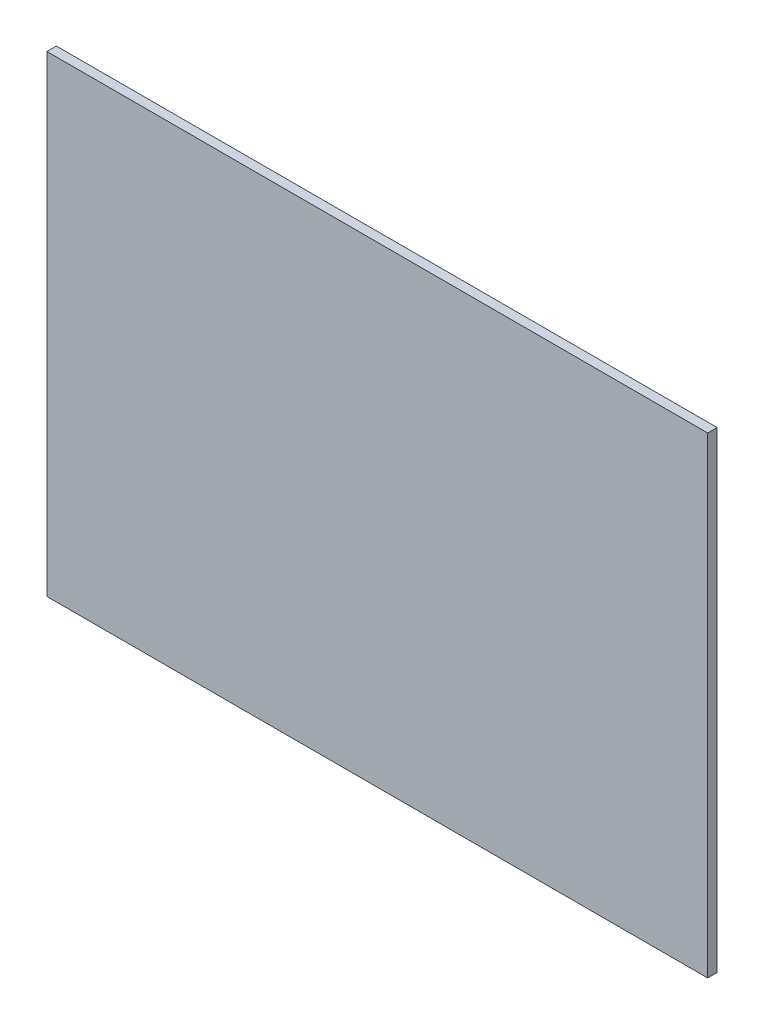
ISO-10303-21;
HEADER;
FILE_DESCRIPTION(('STEP AP214'),'2;1');
FILE_NAME('part.step','',(''),(''),'','','');
FILE_SCHEMA(('AUTOMOTIVE_DESIGN { 1 0 10303 214 1 1 1 1 }'));
ENDSEC;
DATA;
#1=APPLICATION_CONTEXT('core data for automotive mechanical design processes');
#2=APPLICATION_PROTOCOL_DEFINITION('international standard','automotive_design',2000,#1);
#3=PRODUCT_CONTEXT('',#1,'mechanical');
#4=PRODUCT('Part','Part','',(#3));
#5=PRODUCT_RELATED_PRODUCT_CATEGORY('part','',(#4));
#6=PRODUCT_DEFINITION_FORMATION('','',#4);
#7=PRODUCT_DEFINITION_CONTEXT('part definition',#1,'design');
#8=PRODUCT_DEFINITION('design','',#6,#7);
#9=PRODUCT_DEFINITION_SHAPE('','',#8);
#10=(LENGTH_UNIT() NAMED_UNIT(*) SI_UNIT(.MILLI.,.METRE.));
#11=(NAMED_UNIT(*) PLANE_ANGLE_UNIT() SI_UNIT($,.RADIAN.));
#12=(NAMED_UNIT(*) SI_UNIT($,.STERADIAN.) SOLID_ANGLE_UNIT());
#13=UNCERTAINTY_MEASURE_WITH_UNIT(LENGTH_MEASURE(1.E-05),#10,'distance_accuracy_value','');
#14=(GEOMETRIC_REPRESENTATION_CONTEXT(3) GLOBAL_UNCERTAINTY_ASSIGNED_CONTEXT((#13)) GLOBAL_UNIT_ASSIGNED_CONTEXT((#10,
#11,#12)) REPRESENTATION_CONTEXT('',''));
#15=CARTESIAN_POINT('',(0.,0.,0.));
#16=DIRECTION('',(0.,0.,1.));
#17=DIRECTION('',(1.,0.,0.));
#18=AXIS2_PLACEMENT_3D('',#15,#16,#17);
#19=CARTESIAN_POINT('',(0.,0.,10.));
#20=DIRECTION('',(-1.,0.,0.));
#21=DIRECTION('',(0.,-1.,0.));
#22=AXIS2_PLACEMENT_3D('',#19,#20,#21);
#23=PLANE('',#22);
#24=DIRECTION('',(0.,1.,0.));
#25=VECTOR('',#24,1.);
#26=CARTESIAN_POINT('',(0.,0.,0.));
#27=LINE('',#26,#25);
#28=CARTESIAN_POINT('',(0.,0.,0.));
#29=VERTEX_POINT('',#28);
#30=CARTESIAN_POINT('',(0.,500.,0.));
#31=VERTEX_POINT('',#30);
#32=EDGE_CURVE('E96',#29,#31,#27,.T.);
#33=ORIENTED_EDGE('',*,*,#32,.T.);
#34=DIRECTION('',(0.,0.,-1.));
#35=VECTOR('',#34,1.);
#36=CARTESIAN_POINT('',(0.,500.,10.));
#37=LINE('',#36,#35);
#38=CARTESIAN_POINT('',(0.,500.,10.));
#39=VERTEX_POINT('',#38);
#40=EDGE_CURVE('E11',#39,#31,#37,.T.);
#41=ORIENTED_EDGE('',*,*,#40,.F.);
#42=DIRECTION('',(0.,1.,0.));
#43=VECTOR('',#42,1.);
#44=CARTESIAN_POINT('',(0.,0.,10.));
#45=LINE('',#44,#43);
#46=CARTESIAN_POINT('',(0.,0.,10.));
#47=VERTEX_POINT('',#46);
#48=EDGE_CURVE('E84',#47,#39,#45,.T.);
#49=ORIENTED_EDGE('',*,*,#48,.F.);
#50=DIRECTION('',(0.,0.,-1.));
#51=VECTOR('',#50,1.);
#52=CARTESIAN_POINT('',(0.,0.,10.));
#53=LINE('',#52,#51);
#54=EDGE_CURVE('E92',#47,#29,#53,.T.);
#55=ORIENTED_EDGE('',*,*,#54,.T.);
#56=EDGE_LOOP('',(#33,#41,#49,#55));
#57=FACE_BOUND('',#56,.T.);
#58=ADVANCED_FACE('F33',(#57),#23,.F.);
#59=CARTESIAN_POINT('',(0.,500.,10.));
#60=DIRECTION('',(0.,-1.,0.));
#61=DIRECTION('',(1.,0.,0.));
#62=AXIS2_PLACEMENT_3D('',#59,#60,#61);
#63=PLANE('',#62);
#64=DIRECTION('',(-1.,0.,0.));
#65=VECTOR('',#64,1.);
#66=CARTESIAN_POINT('',(0.,500.,0.));
#67=LINE('',#66,#65);
#68=CARTESIAN_POINT('',(-700.,500.,0.));
#69=VERTEX_POINT('',#68);
#70=EDGE_CURVE('E88',#31,#69,#67,.T.);
#71=ORIENTED_EDGE('',*,*,#70,.T.);
#72=DIRECTION('',(0.,0.,-1.));
#73=VECTOR('',#72,1.);
#74=CARTESIAN_POINT('',(-700.,500.,10.));
#75=LINE('',#74,#73);
#76=CARTESIAN_POINT('',(-700.,500.,10.));
#77=VERTEX_POINT('',#76);
#78=EDGE_CURVE('E41',#77,#69,#75,.T.);
#79=ORIENTED_EDGE('',*,*,#78,.F.);
#80=DIRECTION('',(-1.,0.,0.));
#81=VECTOR('',#80,1.);
#82=CARTESIAN_POINT('',(0.,500.,10.));
#83=LINE('',#82,#81);
#84=EDGE_CURVE('E79',#39,#77,#83,.T.);
#85=ORIENTED_EDGE('',*,*,#84,.F.);
#86=ORIENTED_EDGE('',*,*,#40,.T.);
#87=EDGE_LOOP('',(#71,#79,#85,#86));
#88=FACE_BOUND('',#87,.T.);
#89=ADVANCED_FACE('F87',(#88),#63,.F.);
#90=CARTESIAN_POINT('',(-700.,0.,10.));
#91=DIRECTION('',(1.,0.,0.));
#92=DIRECTION('',(0.,0.,-1.));
#93=AXIS2_PLACEMENT_3D('',#90,#91,#92);
#94=PLANE('',#93);
#95=DIRECTION('',(0.,-1.,0.));
#96=VECTOR('',#95,1.);
#97=CARTESIAN_POINT('',(-700.,0.,0.));
#98=LINE('',#97,#96);
#99=CARTESIAN_POINT('',(-700.,0.,0.));
#100=VERTEX_POINT('',#99);
#101=EDGE_CURVE('E66',#69,#100,#98,.T.);
#102=ORIENTED_EDGE('',*,*,#101,.T.);
#103=DIRECTION('',(0.,0.,-1.));
#104=VECTOR('',#103,1.);
#105=CARTESIAN_POINT('',(-700.,0.,10.));
#106=LINE('',#105,#104);
#107=CARTESIAN_POINT('',(-700.,0.,10.));
#108=VERTEX_POINT('',#107);
#109=EDGE_CURVE('E89',#108,#100,#106,.T.);
#110=ORIENTED_EDGE('',*,*,#109,.F.);
#111=DIRECTION('',(0.,-1.,0.));
#112=VECTOR('',#111,1.);
#113=CARTESIAN_POINT('',(-700.,0.,10.));
#114=LINE('',#113,#112);
#115=EDGE_CURVE('E82',#77,#108,#114,.T.);
#116=ORIENTED_EDGE('',*,*,#115,.F.);
#117=ORIENTED_EDGE('',*,*,#78,.T.);
#118=EDGE_LOOP('',(#102,#110,#116,#117));
#119=FACE_BOUND('',#118,.T.);
#120=ADVANCED_FACE('F90',(#119),#94,.F.);
#121=CARTESIAN_POINT('',(0.,0.,10.));
#122=DIRECTION('',(0.,1.,0.));
#123=DIRECTION('',(0.,0.,1.));
#124=AXIS2_PLACEMENT_3D('',#121,#122,#123);
#125=PLANE('',#124);
#126=DIRECTION('',(1.,0.,0.));
#127=VECTOR('',#126,1.);
#128=CARTESIAN_POINT('',(0.,0.,0.));
#129=LINE('',#128,#127);
#130=EDGE_CURVE('E72',#100,#29,#129,.T.);
#131=ORIENTED_EDGE('',*,*,#130,.T.);
#132=ORIENTED_EDGE('',*,*,#54,.F.);
#133=DIRECTION('',(1.,0.,0.));
#134=VECTOR('',#133,1.);
#135=CARTESIAN_POINT('',(0.,0.,10.));
#136=LINE('',#135,#134);
#137=EDGE_CURVE('E49',#108,#47,#136,.T.);
#138=ORIENTED_EDGE('',*,*,#137,.F.);
#139=ORIENTED_EDGE('',*,*,#109,.T.);
#140=EDGE_LOOP('',(#131,#132,#138,#139));
#141=FACE_BOUND('',#140,.T.);
#142=ADVANCED_FACE('F103',(#141),#125,.F.);
#143=CARTESIAN_POINT('',(0.,0.,10.));
#144=DIRECTION('',(0.,0.,1.));
#145=DIRECTION('',(1.,0.,0.));
#146=AXIS2_PLACEMENT_3D('',#143,#144,#145);
#147=PLANE('',#146);
#148=ORIENTED_EDGE('',*,*,#48,.T.);
#149=ORIENTED_EDGE('',*,*,#84,.T.);
#150=ORIENTED_EDGE('',*,*,#115,.T.);
#151=ORIENTED_EDGE('',*,*,#137,.T.);
#152=EDGE_LOOP('',(#148,#149,#150,#151));
#153=FACE_BOUND('',#152,.T.);
#154=ADVANCED_FACE('F80',(#153),#147,.T.);
#155=CARTESIAN_POINT('',(0.,0.,0.));
#156=DIRECTION('',(0.,0.,1.));
#157=DIRECTION('',(1.,0.,0.));
#158=AXIS2_PLACEMENT_3D('',#155,#156,#157);
#159=PLANE('',#158);
#160=ORIENTED_EDGE('',*,*,#32,.F.);
#161=ORIENTED_EDGE('',*,*,#130,.F.);
#162=ORIENTED_EDGE('',*,*,#101,.F.);
#163=ORIENTED_EDGE('',*,*,#70,.F.);
#164=EDGE_LOOP('',(#160,#161,#162,#163));
#165=FACE_BOUND('',#164,.T.);
#166=ADVANCED_FACE('F106',(#165),#159,.F.);
#167=CLOSED_SHELL('',(#58,#89,#120,#142,#154,#166));
#168=MANIFOLD_SOLID_BREP('B2',#167);
#169=ADVANCED_BREP_SHAPE_REPRESENTATION('',(#18,#168),#14);
#170=SHAPE_DEFINITION_REPRESENTATION(#9,#169);
ENDSEC;
END-ISO-10303-21;
